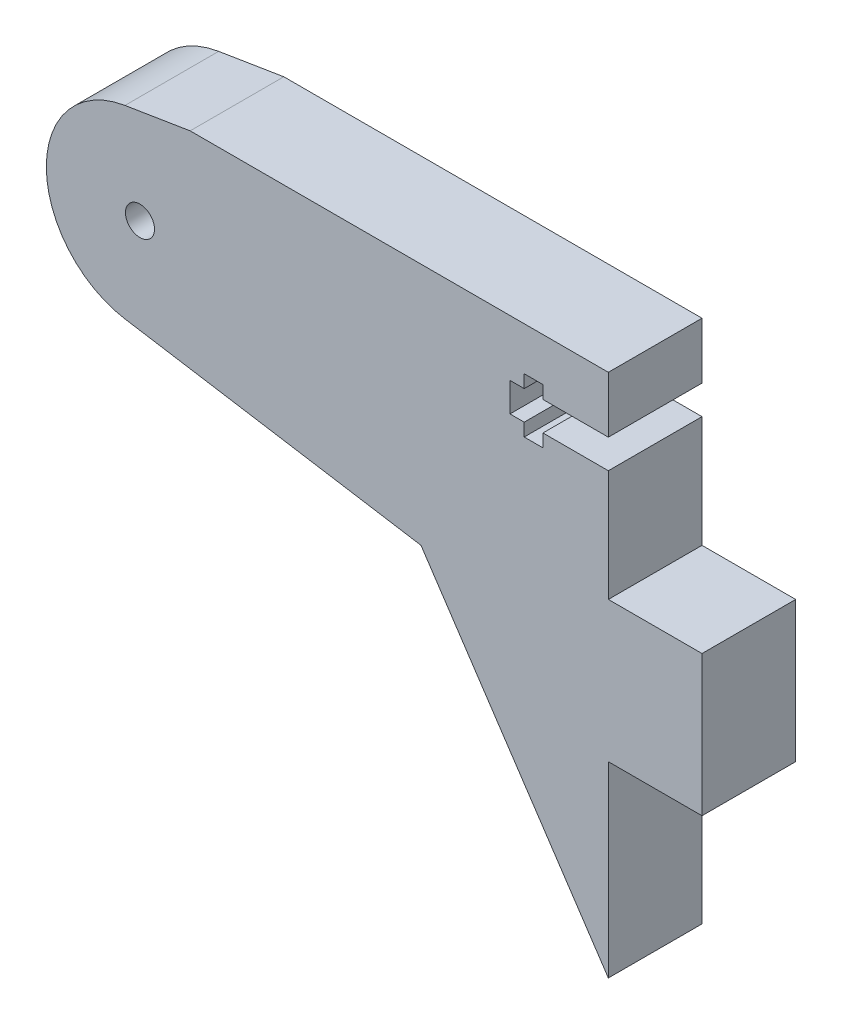
ISO-10303-21;
HEADER;
FILE_DESCRIPTION(('STEP AP214'),'2;1');
FILE_NAME('part.step','',(''),(''),'','','');
FILE_SCHEMA(('AUTOMOTIVE_DESIGN { 1 0 10303 214 1 1 1 1 }'));
ENDSEC;
DATA;
#1=APPLICATION_CONTEXT('core data for automotive mechanical design processes');
#2=APPLICATION_PROTOCOL_DEFINITION('international standard','automotive_design',2000,#1);
#3=PRODUCT_CONTEXT('',#1,'mechanical');
#4=PRODUCT('Part','Part','',(#3));
#5=PRODUCT_RELATED_PRODUCT_CATEGORY('part','',(#4));
#6=PRODUCT_DEFINITION_FORMATION('','',#4);
#7=PRODUCT_DEFINITION_CONTEXT('part definition',#1,'design');
#8=PRODUCT_DEFINITION('design','',#6,#7);
#9=PRODUCT_DEFINITION_SHAPE('','',#8);
#10=(LENGTH_UNIT() NAMED_UNIT(*) SI_UNIT(.MILLI.,.METRE.));
#11=(NAMED_UNIT(*) PLANE_ANGLE_UNIT() SI_UNIT($,.RADIAN.));
#12=(NAMED_UNIT(*) SI_UNIT($,.STERADIAN.) SOLID_ANGLE_UNIT());
#13=UNCERTAINTY_MEASURE_WITH_UNIT(LENGTH_MEASURE(1.E-05),#10,'distance_accuracy_value','');
#14=(GEOMETRIC_REPRESENTATION_CONTEXT(3) GLOBAL_UNCERTAINTY_ASSIGNED_CONTEXT((#13)) GLOBAL_UNIT_ASSIGNED_CONTEXT((#10,
#11,#12)) REPRESENTATION_CONTEXT('',''));
#15=CARTESIAN_POINT('',(0.,0.,0.));
#16=DIRECTION('',(0.,0.,1.));
#17=DIRECTION('',(1.,0.,0.));
#18=AXIS2_PLACEMENT_3D('',#15,#16,#17);
#19=CARTESIAN_POINT('',(-447.064585695293,-68.9557688613445,10.));
#20=DIRECTION('',(-1.,0.,0.));
#21=DIRECTION('',(0.,0.,1.));
#22=AXIS2_PLACEMENT_3D('',#19,#20,#21);
#23=PLANE('',#22);
#24=DIRECTION('',(0.,1.,0.));
#25=VECTOR('',#24,1.);
#26=CARTESIAN_POINT('',(-447.064585695293,-68.9557688613445,0.));
#27=LINE('',#26,#25);
#28=CARTESIAN_POINT('',(-447.064585695293,-78.9557688613445,0.));
#29=VERTEX_POINT('',#28);
#30=CARTESIAN_POINT('',(-447.064585695293,-72.9557688613445,0.));
#31=VERTEX_POINT('',#30);
#32=EDGE_CURVE('E196',#29,#31,#27,.T.);
#33=ORIENTED_EDGE('',*,*,#32,.T.);
#34=DIRECTION('',(0.,0.,-1.));
#35=VECTOR('',#34,1.);
#36=CARTESIAN_POINT('',(-447.064585695293,-72.9557688613445,10.));
#37=LINE('',#36,#35);
#38=CARTESIAN_POINT('',(-447.064585695293,-72.9557688613445,10.));
#39=VERTEX_POINT('',#38);
#40=EDGE_CURVE('E49',#39,#31,#37,.T.);
#41=ORIENTED_EDGE('',*,*,#40,.F.);
#42=DIRECTION('',(0.,1.,0.));
#43=VECTOR('',#42,1.);
#44=CARTESIAN_POINT('',(-447.064585695293,-68.9557688613445,10.));
#45=LINE('',#44,#43);
#46=CARTESIAN_POINT('',(-447.064585695293,-78.9557688613445,10.));
#47=VERTEX_POINT('',#46);
#48=EDGE_CURVE('E194',#47,#39,#45,.T.);
#49=ORIENTED_EDGE('',*,*,#48,.F.);
#50=DIRECTION('',(0.,0.,-1.));
#51=VECTOR('',#50,1.);
#52=CARTESIAN_POINT('',(-447.064585695293,-78.9557688613445,10.));
#53=LINE('',#52,#51);
#54=EDGE_CURVE('E330',#47,#29,#53,.T.);
#55=ORIENTED_EDGE('',*,*,#54,.T.);
#56=EDGE_LOOP('',(#33,#41,#49,#55));
#57=FACE_BOUND('',#56,.T.);
#58=ADVANCED_FACE('F34',(#57),#23,.F.);
#59=CARTESIAN_POINT('',(-467.064585695293,-68.9557688613445,10.));
#60=DIRECTION('',(0.160208282495524,-0.987083231657713,0.));
#61=DIRECTION('',(0.987083231657713,0.160208282495524,0.));
#62=AXIS2_PLACEMENT_3D('',#59,#60,#61);
#63=PLANE('',#62);
#64=DIRECTION('',(-0.987083231657713,-0.160208282495524,0.));
#65=VECTOR('',#64,1.);
#66=CARTESIAN_POINT('',(-467.064585695293,-68.9557688613445,10.));
#67=LINE('',#66,#65);
#68=CARTESIAN_POINT('',(-491.709584475186,-72.9557688613445,10.));
#69=VERTEX_POINT('',#68);
#70=CARTESIAN_POINT('',(-498.666668520249,-74.0849365447674,10.));
#71=VERTEX_POINT('',#70);
#72=EDGE_CURVE('E246',#69,#71,#67,.T.);
#73=ORIENTED_EDGE('',*,*,#72,.F.);
#74=DIRECTION('',(0.,0.,-1.));
#75=VECTOR('',#74,1.);
#76=CARTESIAN_POINT('',(-491.709584475186,-72.9557688613445,10.));
#77=LINE('',#76,#75);
#78=CARTESIAN_POINT('',(-491.709584475186,-72.9557688613445,0.));
#79=VERTEX_POINT('',#78);
#80=EDGE_CURVE('E184',#69,#79,#77,.T.);
#81=ORIENTED_EDGE('',*,*,#80,.T.);
#82=DIRECTION('',(-0.987083231657713,-0.160208282495524,0.));
#83=VECTOR('',#82,1.);
#84=CARTESIAN_POINT('',(-467.064585695293,-68.9557688613445,0.));
#85=LINE('',#84,#83);
#86=CARTESIAN_POINT('',(-498.666668520249,-74.0849365447674,0.));
#87=VERTEX_POINT('',#86);
#88=EDGE_CURVE('E243',#79,#87,#85,.T.);
#89=ORIENTED_EDGE('',*,*,#88,.T.);
#90=DIRECTION('',(0.,0.,-1.));
#91=VECTOR('',#90,1.);
#92=CARTESIAN_POINT('',(-498.666668520249,-74.0849365447674,10.));
#93=LINE('',#92,#91);
#94=EDGE_CURVE('E11',#71,#87,#93,.T.);
#95=ORIENTED_EDGE('',*,*,#94,.F.);
#96=EDGE_LOOP('',(#73,#81,#89,#95));
#97=FACE_BOUND('',#96,.T.);
#98=ADVANCED_FACE('F36',(#97),#63,.F.);
#99=CARTESIAN_POINT('',(-497.064585695293,-83.9557688613445,10.));
#100=DIRECTION('',(0.,0.,-1.));
#101=DIRECTION('',(-1.,0.,0.));
#102=AXIS2_PLACEMENT_3D('',#99,#100,#101);
#103=CYLINDRICAL_SURFACE('',#102,9.99999999999999);
#104=CARTESIAN_POINT('',(-497.064585695293,-83.9557688613445,0.));
#105=DIRECTION('',(0.,0.,1.));
#106=DIRECTION('',(1.,0.,0.));
#107=AXIS2_PLACEMENT_3D('',#104,#105,#106);
#108=CIRCLE('',#107,9.99999999999999);
#109=CARTESIAN_POINT('',(-498.666668520249,-93.8266011779216,0.));
#110=VERTEX_POINT('',#109);
#111=EDGE_CURVE('E261',#87,#110,#108,.T.);
#112=ORIENTED_EDGE('',*,*,#111,.T.);
#113=DIRECTION('',(0.,0.,-1.));
#114=VECTOR('',#113,1.);
#115=CARTESIAN_POINT('',(-498.666668520249,-93.8266011779216,10.));
#116=LINE('',#115,#114);
#117=CARTESIAN_POINT('',(-498.666668520249,-93.8266011779216,10.));
#118=VERTEX_POINT('',#117);
#119=EDGE_CURVE('E42',#118,#110,#116,.T.);
#120=ORIENTED_EDGE('',*,*,#119,.F.);
#121=CARTESIAN_POINT('',(-497.064585695293,-83.9557688613445,10.));
#122=DIRECTION('',(0.,0.,1.));
#123=DIRECTION('',(1.,0.,0.));
#124=AXIS2_PLACEMENT_3D('',#121,#122,#123);
#125=CIRCLE('',#124,9.99999999999999);
#126=EDGE_CURVE('E248',#71,#118,#125,.T.);
#127=ORIENTED_EDGE('',*,*,#126,.F.);
#128=ORIENTED_EDGE('',*,*,#94,.T.);
#129=EDGE_LOOP('',(#112,#120,#127,#128));
#130=FACE_BOUND('',#129,.T.);
#131=ADVANCED_FACE('F294',(#130),#103,.T.);
#132=CARTESIAN_POINT('',(-467.064585695293,-98.9557688613445,10.));
#133=DIRECTION('',(0.160208282495523,0.987083231657713,0.));
#134=DIRECTION('',(-0.987083231657713,0.160208282495523,0.));
#135=AXIS2_PLACEMENT_3D('',#132,#133,#134);
#136=PLANE('',#135);
#137=DIRECTION('',(0.987083231657713,-0.160208282495523,0.));
#138=VECTOR('',#137,1.);
#139=CARTESIAN_POINT('',(-467.064585695293,-98.9557688613445,0.));
#140=LINE('',#139,#138);
#141=CARTESIAN_POINT('',(-467.064585695293,-98.9557688613445,0.));
#142=VERTEX_POINT('',#141);
#143=EDGE_CURVE('E263',#110,#142,#140,.T.);
#144=ORIENTED_EDGE('',*,*,#143,.T.);
#145=DIRECTION('',(0.,0.,-1.));
#146=VECTOR('',#145,1.);
#147=CARTESIAN_POINT('',(-467.064585695293,-98.9557688613445,10.));
#148=LINE('',#147,#146);
#149=CARTESIAN_POINT('',(-467.064585695293,-98.9557688613445,10.));
#150=VERTEX_POINT('',#149);
#151=EDGE_CURVE('E271',#150,#142,#148,.T.);
#152=ORIENTED_EDGE('',*,*,#151,.F.);
#153=DIRECTION('',(0.987083231657713,-0.160208282495523,0.));
#154=VECTOR('',#153,1.);
#155=CARTESIAN_POINT('',(-467.064585695293,-98.9557688613445,10.));
#156=LINE('',#155,#154);
#157=EDGE_CURVE('E251',#118,#150,#156,.T.);
#158=ORIENTED_EDGE('',*,*,#157,.F.);
#159=ORIENTED_EDGE('',*,*,#119,.T.);
#160=EDGE_LOOP('',(#144,#152,#158,#159));
#161=FACE_BOUND('',#160,.T.);
#162=ADVANCED_FACE('F278',(#161),#136,.F.);
#163=CARTESIAN_POINT('',(-447.064585695293,-128.955768861344,10.));
#164=DIRECTION('',(0.832050294337844,0.554700196225228,0.));
#165=DIRECTION('',(-0.554700196225228,0.832050294337844,0.));
#166=AXIS2_PLACEMENT_3D('',#163,#164,#165);
#167=PLANE('',#166);
#168=DIRECTION('',(0.554700196225228,-0.832050294337844,0.));
#169=VECTOR('',#168,1.);
#170=CARTESIAN_POINT('',(-447.064585695293,-128.955768861344,0.));
#171=LINE('',#170,#169);
#172=CARTESIAN_POINT('',(-447.064585695293,-128.955768861344,0.));
#173=VERTEX_POINT('',#172);
#174=EDGE_CURVE('E265',#142,#173,#171,.T.);
#175=ORIENTED_EDGE('',*,*,#174,.T.);
#176=DIRECTION('',(0.,0.,-1.));
#177=VECTOR('',#176,1.);
#178=CARTESIAN_POINT('',(-447.064585695293,-128.955768861344,10.));
#179=LINE('',#178,#177);
#180=CARTESIAN_POINT('',(-447.064585695293,-128.955768861344,10.));
#181=VERTEX_POINT('',#180);
#182=EDGE_CURVE('E259',#181,#173,#179,.T.);
#183=ORIENTED_EDGE('',*,*,#182,.F.);
#184=DIRECTION('',(0.554700196225228,-0.832050294337844,0.));
#185=VECTOR('',#184,1.);
#186=CARTESIAN_POINT('',(-447.064585695293,-128.955768861344,10.));
#187=LINE('',#186,#185);
#188=EDGE_CURVE('E253',#150,#181,#187,.T.);
#189=ORIENTED_EDGE('',*,*,#188,.F.);
#190=ORIENTED_EDGE('',*,*,#151,.T.);
#191=EDGE_LOOP('',(#175,#183,#189,#190));
#192=FACE_BOUND('',#191,.T.);
#193=ADVANCED_FACE('F291',(#192),#167,.F.);
#194=CARTESIAN_POINT('',(-437.064585695293,-68.9557688613445,10.));
#195=DIRECTION('',(-1.,0.,0.));
#196=DIRECTION('',(0.,0.,1.));
#197=AXIS2_PLACEMENT_3D('',#194,#195,#196);
#198=PLANE('',#197);
#199=DIRECTION('',(0.,1.,0.));
#200=VECTOR('',#199,1.);
#201=CARTESIAN_POINT('',(-437.064585695293,-68.9557688613445,0.));
#202=LINE('',#201,#200);
#203=CARTESIAN_POINT('',(-437.064585695293,-108.955768861344,0.));
#204=VERTEX_POINT('',#203);
#205=CARTESIAN_POINT('',(-437.064585695293,-93.9557688613445,0.));
#206=VERTEX_POINT('',#205);
#207=EDGE_CURVE('E249',#204,#206,#202,.T.);
#208=ORIENTED_EDGE('',*,*,#207,.T.);
#209=DIRECTION('',(0.,0.,-1.));
#210=VECTOR('',#209,1.);
#211=CARTESIAN_POINT('',(-437.064585695293,-93.9557688613445,10.));
#212=LINE('',#211,#210);
#213=CARTESIAN_POINT('',(-437.064585695293,-93.9557688613445,10.));
#214=VERTEX_POINT('',#213);
#215=EDGE_CURVE('E208',#214,#206,#212,.T.);
#216=ORIENTED_EDGE('',*,*,#215,.F.);
#217=DIRECTION('',(0.,1.,0.));
#218=VECTOR('',#217,1.);
#219=CARTESIAN_POINT('',(-437.064585695293,-128.955768861344,10.));
#220=LINE('',#219,#218);
#221=CARTESIAN_POINT('',(-437.064585695293,-108.955768861344,10.));
#222=VERTEX_POINT('',#221);
#223=EDGE_CURVE('E256',#222,#214,#220,.T.);
#224=ORIENTED_EDGE('',*,*,#223,.F.);
#225=DIRECTION('',(0.,0.,-1.));
#226=VECTOR('',#225,1.);
#227=CARTESIAN_POINT('',(-437.064585695293,-108.955768861344,10.));
#228=LINE('',#227,#226);
#229=EDGE_CURVE('E231',#222,#204,#228,.T.);
#230=ORIENTED_EDGE('',*,*,#229,.T.);
#231=EDGE_LOOP('',(#208,#216,#224,#230));
#232=FACE_BOUND('',#231,.T.);
#233=ADVANCED_FACE('F430',(#232),#198,.F.);
#234=CARTESIAN_POINT('',(-497.064585695293,-83.9557688613445,10.));
#235=DIRECTION('',(0.,0.,1.));
#236=DIRECTION('',(1.,0.,0.));
#237=AXIS2_PLACEMENT_3D('',#234,#235,#236);
#238=PLANE('',#237);
#239=DIRECTION('',(-1.,0.,0.));
#240=VECTOR('',#239,1.);
#241=CARTESIAN_POINT('',(-447.064585695293,-72.9557688613445,10.));
#242=LINE('',#241,#240);
#243=EDGE_CURVE('E181',#39,#69,#242,.T.);
#244=ORIENTED_EDGE('',*,*,#243,.T.);
#245=ORIENTED_EDGE('',*,*,#72,.T.);
#246=ORIENTED_EDGE('',*,*,#126,.T.);
#247=ORIENTED_EDGE('',*,*,#157,.T.);
#248=ORIENTED_EDGE('',*,*,#188,.T.);
#249=DIRECTION('',(0.,1.,0.));
#250=VECTOR('',#249,1.);
#251=CARTESIAN_POINT('',(-447.064585695293,-108.955768861344,10.));
#252=LINE('',#251,#250);
#253=CARTESIAN_POINT('',(-447.064585695293,-108.955768861344,10.));
#254=VERTEX_POINT('',#253);
#255=EDGE_CURVE('E227',#181,#254,#252,.T.);
#256=ORIENTED_EDGE('',*,*,#255,.T.);
#257=DIRECTION('',(1.,0.,0.));
#258=VECTOR('',#257,1.);
#259=CARTESIAN_POINT('',(-437.064585695293,-108.955768861344,10.));
#260=LINE('',#259,#258);
#261=EDGE_CURVE('E224',#254,#222,#260,.T.);
#262=ORIENTED_EDGE('',*,*,#261,.T.);
#263=ORIENTED_EDGE('',*,*,#223,.T.);
#264=DIRECTION('',(-1.,0.,0.));
#265=VECTOR('',#264,1.);
#266=CARTESIAN_POINT('',(-437.064585695293,-93.9557688613445,10.));
#267=LINE('',#266,#265);
#268=CARTESIAN_POINT('',(-447.064585695293,-93.9557688613445,10.));
#269=VERTEX_POINT('',#268);
#270=EDGE_CURVE('E205',#214,#269,#267,.T.);
#271=ORIENTED_EDGE('',*,*,#270,.T.);
#272=CARTESIAN_POINT('',(-447.064585695293,-82.0557688613445,10.));
#273=VERTEX_POINT('',#272);
#274=EDGE_CURVE('E204',#269,#273,#45,.T.);
#275=ORIENTED_EDGE('',*,*,#274,.T.);
#276=DIRECTION('',(-1.,0.,0.));
#277=VECTOR('',#276,1.);
#278=CARTESIAN_POINT('',(-447.064585695293,-82.0557688613445,10.));
#279=LINE('',#278,#277);
#280=CARTESIAN_POINT('',(-454.046285695293,-82.0557688613445,10.));
#281=VERTEX_POINT('',#280);
#282=EDGE_CURVE('E57',#273,#281,#279,.T.);
#283=ORIENTED_EDGE('',*,*,#282,.T.);
#284=DIRECTION('',(0.,-1.,0.));
#285=VECTOR('',#284,1.);
#286=CARTESIAN_POINT('',(-454.046285695293,-82.0557688613445,10.));
#287=LINE('',#286,#285);
#288=CARTESIAN_POINT('',(-454.046285695293,-83.4307688613445,10.));
#289=VERTEX_POINT('',#288);
#290=EDGE_CURVE('E304',#281,#289,#287,.T.);
#291=ORIENTED_EDGE('',*,*,#290,.T.);
#292=DIRECTION('',(-1.,0.,0.));
#293=VECTOR('',#292,1.);
#294=CARTESIAN_POINT('',(-454.046285695293,-83.4307688613445,10.));
#295=LINE('',#294,#293);
#296=CARTESIAN_POINT('',(-456.046285695293,-83.4307688613445,10.));
#297=VERTEX_POINT('',#296);
#298=EDGE_CURVE('E307',#289,#297,#295,.T.);
#299=ORIENTED_EDGE('',*,*,#298,.T.);
#300=DIRECTION('',(0.,1.,0.));
#301=VECTOR('',#300,1.);
#302=CARTESIAN_POINT('',(-456.046285695293,-82.0557688613445,10.));
#303=LINE('',#302,#301);
#304=CARTESIAN_POINT('',(-456.046285695293,-82.0557688613445,10.));
#305=VERTEX_POINT('',#304);
#306=EDGE_CURVE('E310',#297,#305,#303,.T.);
#307=ORIENTED_EDGE('',*,*,#306,.T.);
#308=DIRECTION('',(-1.,0.,0.));
#309=VECTOR('',#308,1.);
#310=CARTESIAN_POINT('',(-456.046285695293,-82.0557688613445,10.));
#311=LINE('',#310,#309);
#312=CARTESIAN_POINT('',(-457.564585695293,-82.0557688613445,10.));
#313=VERTEX_POINT('',#312);
#314=EDGE_CURVE('E313',#305,#313,#311,.T.);
#315=ORIENTED_EDGE('',*,*,#314,.T.);
#316=DIRECTION('',(0.,1.,0.));
#317=VECTOR('',#316,1.);
#318=CARTESIAN_POINT('',(-457.564585695293,-78.9557688613445,10.));
#319=LINE('',#318,#317);
#320=CARTESIAN_POINT('',(-457.564585695293,-78.9557688613445,10.));
#321=VERTEX_POINT('',#320);
#322=EDGE_CURVE('E316',#313,#321,#319,.T.);
#323=ORIENTED_EDGE('',*,*,#322,.T.);
#324=DIRECTION('',(1.,0.,0.));
#325=VECTOR('',#324,1.);
#326=CARTESIAN_POINT('',(-456.046285695293,-78.9557688613445,10.));
#327=LINE('',#326,#325);
#328=CARTESIAN_POINT('',(-456.046285695293,-78.9557688613445,10.));
#329=VERTEX_POINT('',#328);
#330=EDGE_CURVE('E319',#321,#329,#327,.T.);
#331=ORIENTED_EDGE('',*,*,#330,.T.);
#332=DIRECTION('',(0.,1.,0.));
#333=VECTOR('',#332,1.);
#334=CARTESIAN_POINT('',(-456.046285695293,-77.5807688613445,10.));
#335=LINE('',#334,#333);
#336=CARTESIAN_POINT('',(-456.046285695293,-77.5807688613445,10.));
#337=VERTEX_POINT('',#336);
#338=EDGE_CURVE('E322',#329,#337,#335,.T.);
#339=ORIENTED_EDGE('',*,*,#338,.T.);
#340=DIRECTION('',(1.,0.,0.));
#341=VECTOR('',#340,1.);
#342=CARTESIAN_POINT('',(-454.046285695293,-77.5807688613445,10.));
#343=LINE('',#342,#341);
#344=CARTESIAN_POINT('',(-454.046285695293,-77.5807688613445,10.));
#345=VERTEX_POINT('',#344);
#346=EDGE_CURVE('E325',#337,#345,#343,.T.);
#347=ORIENTED_EDGE('',*,*,#346,.T.);
#348=DIRECTION('',(0.,-1.,0.));
#349=VECTOR('',#348,1.);
#350=CARTESIAN_POINT('',(-454.046285695293,-77.5807688613445,10.));
#351=LINE('',#350,#349);
#352=CARTESIAN_POINT('',(-454.046285695293,-78.9557688613445,10.));
#353=VERTEX_POINT('',#352);
#354=EDGE_CURVE('E328',#345,#353,#351,.T.);
#355=ORIENTED_EDGE('',*,*,#354,.T.);
#356=DIRECTION('',(1.,0.,0.));
#357=VECTOR('',#356,1.);
#358=CARTESIAN_POINT('',(-447.064585695293,-78.9557688613445,10.));
#359=LINE('',#358,#357);
#360=EDGE_CURVE('E203',#353,#47,#359,.T.);
#361=ORIENTED_EDGE('',*,*,#360,.T.);
#362=ORIENTED_EDGE('',*,*,#48,.T.);
#363=EDGE_LOOP('',(#244,#245,#246,#247,#248,#256,#262,#263,#271,#275,#283,#291,#299,#307,#315,
#323,#331,#339,#347,#355,#361,#362));
#364=FACE_BOUND('',#363,.T.);
#365=CARTESIAN_POINT('',(-497.064585695293,-83.9557688613445,10.));
#366=DIRECTION('',(0.,0.,1.));
#367=DIRECTION('',(1.,0.,0.));
#368=AXIS2_PLACEMENT_3D('',#365,#366,#367);
#369=CIRCLE('',#368,1.54999999999999);
#370=CARTESIAN_POINT('',(-495.514585695293,-83.9557688613445,10.));
#371=VERTEX_POINT('',#370);
#372=EDGE_CURVE('E237',#371,#371,#369,.T.);
#373=ORIENTED_EDGE('',*,*,#372,.F.);
#374=EDGE_LOOP('',(#373));
#375=FACE_BOUND('',#374,.T.);
#376=ADVANCED_FACE('F199',(#364,#375),#238,.T.);
#377=CARTESIAN_POINT('',(-497.064585695293,-83.9557688613445,0.));
#378=DIRECTION('',(0.,0.,1.));
#379=DIRECTION('',(1.,0.,0.));
#380=AXIS2_PLACEMENT_3D('',#377,#378,#379);
#381=PLANE('',#380);
#382=CARTESIAN_POINT('',(-497.064585695293,-83.9557688613445,0.));
#383=DIRECTION('',(0.,0.,1.));
#384=DIRECTION('',(1.,0.,0.));
#385=AXIS2_PLACEMENT_3D('',#382,#383,#384);
#386=CIRCLE('',#385,1.54999999999999);
#387=CARTESIAN_POINT('',(-495.514585695293,-83.9557688613445,0.));
#388=VERTEX_POINT('',#387);
#389=EDGE_CURVE('E240',#388,#388,#386,.T.);
#390=ORIENTED_EDGE('',*,*,#389,.T.);
#391=EDGE_LOOP('',(#390));
#392=FACE_BOUND('',#391,.T.);
#393=ORIENTED_EDGE('',*,*,#88,.F.);
#394=DIRECTION('',(-1.,0.,0.));
#395=VECTOR('',#394,1.);
#396=CARTESIAN_POINT('',(-447.064585695293,-72.9557688613445,0.));
#397=LINE('',#396,#395);
#398=EDGE_CURVE('E188',#31,#79,#397,.T.);
#399=ORIENTED_EDGE('',*,*,#398,.F.);
#400=ORIENTED_EDGE('',*,*,#32,.F.);
#401=DIRECTION('',(1.,0.,0.));
#402=VECTOR('',#401,1.);
#403=CARTESIAN_POINT('',(-447.064585695293,-78.9557688613445,0.));
#404=LINE('',#403,#402);
#405=CARTESIAN_POINT('',(-454.046285695293,-78.9557688613445,0.));
#406=VERTEX_POINT('',#405);
#407=EDGE_CURVE('E299',#406,#29,#404,.T.);
#408=ORIENTED_EDGE('',*,*,#407,.F.);
#409=DIRECTION('',(0.,-1.,0.));
#410=VECTOR('',#409,1.);
#411=CARTESIAN_POINT('',(-454.046285695293,-77.5807688613445,0.));
#412=LINE('',#411,#410);
#413=CARTESIAN_POINT('',(-454.046285695293,-77.5807688613445,0.));
#414=VERTEX_POINT('',#413);
#415=EDGE_CURVE('E302',#414,#406,#412,.T.);
#416=ORIENTED_EDGE('',*,*,#415,.F.);
#417=DIRECTION('',(1.,0.,0.));
#418=VECTOR('',#417,1.);
#419=CARTESIAN_POINT('',(-454.046285695293,-77.5807688613445,0.));
#420=LINE('',#419,#418);
#421=CARTESIAN_POINT('',(-456.046285695293,-77.5807688613445,0.));
#422=VERTEX_POINT('',#421);
#423=EDGE_CURVE('E356',#422,#414,#420,.T.);
#424=ORIENTED_EDGE('',*,*,#423,.F.);
#425=DIRECTION('',(0.,1.,0.));
#426=VECTOR('',#425,1.);
#427=CARTESIAN_POINT('',(-456.046285695293,-77.5807688613445,0.));
#428=LINE('',#427,#426);
#429=CARTESIAN_POINT('',(-456.046285695293,-78.9557688613445,0.));
#430=VERTEX_POINT('',#429);
#431=EDGE_CURVE('E353',#430,#422,#428,.T.);
#432=ORIENTED_EDGE('',*,*,#431,.F.);
#433=DIRECTION('',(1.,0.,0.));
#434=VECTOR('',#433,1.);
#435=CARTESIAN_POINT('',(-456.046285695293,-78.9557688613445,0.));
#436=LINE('',#435,#434);
#437=CARTESIAN_POINT('',(-457.564585695293,-78.9557688613445,0.));
#438=VERTEX_POINT('',#437);
#439=EDGE_CURVE('E350',#438,#430,#436,.T.);
#440=ORIENTED_EDGE('',*,*,#439,.F.);
#441=DIRECTION('',(0.,1.,0.));
#442=VECTOR('',#441,1.);
#443=CARTESIAN_POINT('',(-457.564585695293,-78.9557688613445,0.));
#444=LINE('',#443,#442);
#445=CARTESIAN_POINT('',(-457.564585695293,-82.0557688613445,0.));
#446=VERTEX_POINT('',#445);
#447=EDGE_CURVE('E347',#446,#438,#444,.T.);
#448=ORIENTED_EDGE('',*,*,#447,.F.);
#449=DIRECTION('',(-1.,0.,0.));
#450=VECTOR('',#449,1.);
#451=CARTESIAN_POINT('',(-456.046285695293,-82.0557688613445,0.));
#452=LINE('',#451,#450);
#453=CARTESIAN_POINT('',(-456.046285695293,-82.0557688613445,0.));
#454=VERTEX_POINT('',#453);
#455=EDGE_CURVE('E344',#454,#446,#452,.T.);
#456=ORIENTED_EDGE('',*,*,#455,.F.);
#457=DIRECTION('',(0.,1.,0.));
#458=VECTOR('',#457,1.);
#459=CARTESIAN_POINT('',(-456.046285695293,-82.0557688613445,0.));
#460=LINE('',#459,#458);
#461=CARTESIAN_POINT('',(-456.046285695293,-83.4307688613445,0.));
#462=VERTEX_POINT('',#461);
#463=EDGE_CURVE('E341',#462,#454,#460,.T.);
#464=ORIENTED_EDGE('',*,*,#463,.F.);
#465=DIRECTION('',(-1.,0.,0.));
#466=VECTOR('',#465,1.);
#467=CARTESIAN_POINT('',(-454.046285695293,-83.4307688613445,0.));
#468=LINE('',#467,#466);
#469=CARTESIAN_POINT('',(-454.046285695293,-83.4307688613445,0.));
#470=VERTEX_POINT('',#469);
#471=EDGE_CURVE('E338',#470,#462,#468,.T.);
#472=ORIENTED_EDGE('',*,*,#471,.F.);
#473=DIRECTION('',(0.,-1.,0.));
#474=VECTOR('',#473,1.);
#475=CARTESIAN_POINT('',(-454.046285695293,-82.0557688613445,0.));
#476=LINE('',#475,#474);
#477=CARTESIAN_POINT('',(-454.046285695293,-82.0557688613445,0.));
#478=VERTEX_POINT('',#477);
#479=EDGE_CURVE('E335',#478,#470,#476,.T.);
#480=ORIENTED_EDGE('',*,*,#479,.F.);
#481=DIRECTION('',(-1.,0.,0.));
#482=VECTOR('',#481,1.);
#483=CARTESIAN_POINT('',(-447.064585695293,-82.0557688613445,0.));
#484=LINE('',#483,#482);
#485=CARTESIAN_POINT('',(-447.064585695293,-82.0557688613445,0.));
#486=VERTEX_POINT('',#485);
#487=EDGE_CURVE('E332',#486,#478,#484,.T.);
#488=ORIENTED_EDGE('',*,*,#487,.F.);
#489=CARTESIAN_POINT('',(-447.064585695293,-93.9557688613445,0.));
#490=VERTEX_POINT('',#489);
#491=EDGE_CURVE('E210',#490,#486,#27,.T.);
#492=ORIENTED_EDGE('',*,*,#491,.F.);
#493=DIRECTION('',(-1.,0.,0.));
#494=VECTOR('',#493,1.);
#495=CARTESIAN_POINT('',(-437.064585695293,-93.9557688613445,0.));
#496=LINE('',#495,#494);
#497=EDGE_CURVE('E214',#206,#490,#496,.T.);
#498=ORIENTED_EDGE('',*,*,#497,.F.);
#499=ORIENTED_EDGE('',*,*,#207,.F.);
#500=DIRECTION('',(1.,0.,0.));
#501=VECTOR('',#500,1.);
#502=CARTESIAN_POINT('',(-437.064585695293,-108.955768861344,0.));
#503=LINE('',#502,#501);
#504=CARTESIAN_POINT('',(-447.064585695293,-108.955768861344,0.));
#505=VERTEX_POINT('',#504);
#506=EDGE_CURVE('E222',#505,#204,#503,.T.);
#507=ORIENTED_EDGE('',*,*,#506,.F.);
#508=DIRECTION('',(0.,1.,0.));
#509=VECTOR('',#508,1.);
#510=CARTESIAN_POINT('',(-447.064585695293,-108.955768861344,0.));
#511=LINE('',#510,#509);
#512=EDGE_CURVE('E228',#173,#505,#511,.T.);
#513=ORIENTED_EDGE('',*,*,#512,.F.);
#514=ORIENTED_EDGE('',*,*,#174,.F.);
#515=ORIENTED_EDGE('',*,*,#143,.F.);
#516=ORIENTED_EDGE('',*,*,#111,.F.);
#517=EDGE_LOOP('',(#393,#399,#400,#408,#416,#424,#432,#440,#448,#456,#464,#472,#480,#488,#492,
#498,#499,#507,#513,#514,#515,#516));
#518=FACE_BOUND('',#517,.T.);
#519=ADVANCED_FACE('F286',(#392,#518),#381,.F.);
#520=CARTESIAN_POINT('',(-497.064585695293,-83.9557688613445,0.));
#521=DIRECTION('',(0.,0.,1.));
#522=DIRECTION('',(1.,0.,0.));
#523=AXIS2_PLACEMENT_3D('',#520,#521,#522);
#524=CYLINDRICAL_SURFACE('',#523,1.54999999999999);
#525=ORIENTED_EDGE('',*,*,#389,.F.);
#526=EDGE_LOOP('',(#525));
#527=FACE_BOUND('',#526,.T.);
#528=ORIENTED_EDGE('',*,*,#372,.T.);
#529=EDGE_LOOP('',(#528));
#530=FACE_BOUND('',#529,.T.);
#531=ADVANCED_FACE('F444',(#527,#530),#524,.F.);
#532=CARTESIAN_POINT('',(-437.064585695293,-108.955768861344,10.));
#533=DIRECTION('',(0.,1.,0.));
#534=DIRECTION('',(0.,0.,1.));
#535=AXIS2_PLACEMENT_3D('',#532,#533,#534);
#536=PLANE('',#535);
#537=ORIENTED_EDGE('',*,*,#506,.T.);
#538=ORIENTED_EDGE('',*,*,#229,.F.);
#539=ORIENTED_EDGE('',*,*,#261,.F.);
#540=DIRECTION('',(0.,0.,-1.));
#541=VECTOR('',#540,1.);
#542=CARTESIAN_POINT('',(-447.064585695293,-108.955768861344,10.));
#543=LINE('',#542,#541);
#544=EDGE_CURVE('E235',#254,#505,#543,.T.);
#545=ORIENTED_EDGE('',*,*,#544,.T.);
#546=EDGE_LOOP('',(#537,#538,#539,#545));
#547=FACE_BOUND('',#546,.T.);
#548=ADVANCED_FACE('F434',(#547),#536,.F.);
#549=CARTESIAN_POINT('',(-447.064585695293,-108.955768861344,10.));
#550=DIRECTION('',(-1.,0.,0.));
#551=DIRECTION('',(0.,0.,1.));
#552=AXIS2_PLACEMENT_3D('',#549,#550,#551);
#553=PLANE('',#552);
#554=ORIENTED_EDGE('',*,*,#512,.T.);
#555=ORIENTED_EDGE('',*,*,#544,.F.);
#556=ORIENTED_EDGE('',*,*,#255,.F.);
#557=ORIENTED_EDGE('',*,*,#182,.T.);
#558=EDGE_LOOP('',(#554,#555,#556,#557));
#559=FACE_BOUND('',#558,.T.);
#560=ADVANCED_FACE('F436',(#559),#553,.F.);
#561=ORIENTED_EDGE('',*,*,#491,.T.);
#562=DIRECTION('',(0.,0.,-1.));
#563=VECTOR('',#562,1.);
#564=CARTESIAN_POINT('',(-447.064585695293,-82.0557688613445,10.));
#565=LINE('',#564,#563);
#566=EDGE_CURVE('E380',#273,#486,#565,.T.);
#567=ORIENTED_EDGE('',*,*,#566,.F.);
#568=ORIENTED_EDGE('',*,*,#274,.F.);
#569=DIRECTION('',(0.,0.,-1.));
#570=VECTOR('',#569,1.);
#571=CARTESIAN_POINT('',(-447.064585695293,-93.9557688613445,10.));
#572=LINE('',#571,#570);
#573=EDGE_CURVE('E220',#269,#490,#572,.T.);
#574=ORIENTED_EDGE('',*,*,#573,.T.);
#575=EDGE_LOOP('',(#561,#567,#568,#574));
#576=FACE_BOUND('',#575,.T.);
#577=ADVANCED_FACE('F423',(#576),#23,.F.);
#578=CARTESIAN_POINT('',(-437.064585695293,-93.9557688613445,10.));
#579=DIRECTION('',(0.,-1.,0.));
#580=DIRECTION('',(0.,0.,-1.));
#581=AXIS2_PLACEMENT_3D('',#578,#579,#580);
#582=PLANE('',#581);
#583=ORIENTED_EDGE('',*,*,#497,.T.);
#584=ORIENTED_EDGE('',*,*,#573,.F.);
#585=ORIENTED_EDGE('',*,*,#270,.F.);
#586=ORIENTED_EDGE('',*,*,#215,.T.);
#587=EDGE_LOOP('',(#583,#584,#585,#586));
#588=FACE_BOUND('',#587,.T.);
#589=ADVANCED_FACE('F426',(#588),#582,.F.);
#590=CARTESIAN_POINT('',(-447.064585695293,-78.9557688613445,10.));
#591=DIRECTION('',(0.,1.,0.));
#592=DIRECTION('',(0.,0.,1.));
#593=AXIS2_PLACEMENT_3D('',#590,#591,#592);
#594=PLANE('',#593);
#595=ORIENTED_EDGE('',*,*,#407,.T.);
#596=ORIENTED_EDGE('',*,*,#54,.F.);
#597=ORIENTED_EDGE('',*,*,#360,.F.);
#598=DIRECTION('',(0.,0.,-1.));
#599=VECTOR('',#598,1.);
#600=CARTESIAN_POINT('',(-454.046285695293,-78.9557688613445,10.));
#601=LINE('',#600,#599);
#602=EDGE_CURVE('E217',#353,#406,#601,.T.);
#603=ORIENTED_EDGE('',*,*,#602,.T.);
#604=EDGE_LOOP('',(#595,#596,#597,#603));
#605=FACE_BOUND('',#604,.T.);
#606=ADVANCED_FACE('F382',(#605),#594,.F.);
#607=CARTESIAN_POINT('',(-454.046285695293,-77.5807688613445,10.));
#608=DIRECTION('',(1.,0.,0.));
#609=DIRECTION('',(0.,0.,-1.));
#610=AXIS2_PLACEMENT_3D('',#607,#608,#609);
#611=PLANE('',#610);
#612=ORIENTED_EDGE('',*,*,#415,.T.);
#613=ORIENTED_EDGE('',*,*,#602,.F.);
#614=ORIENTED_EDGE('',*,*,#354,.F.);
#615=DIRECTION('',(0.,0.,-1.));
#616=VECTOR('',#615,1.);
#617=CARTESIAN_POINT('',(-454.046285695293,-77.5807688613445,10.));
#618=LINE('',#617,#616);
#619=EDGE_CURVE('E362',#345,#414,#618,.T.);
#620=ORIENTED_EDGE('',*,*,#619,.T.);
#621=EDGE_LOOP('',(#612,#613,#614,#620));
#622=FACE_BOUND('',#621,.T.);
#623=ADVANCED_FACE('F387',(#622),#611,.F.);
#624=CARTESIAN_POINT('',(-454.046285695293,-77.5807688613445,10.));
#625=DIRECTION('',(0.,1.,0.));
#626=DIRECTION('',(0.,0.,1.));
#627=AXIS2_PLACEMENT_3D('',#624,#625,#626);
#628=PLANE('',#627);
#629=ORIENTED_EDGE('',*,*,#423,.T.);
#630=ORIENTED_EDGE('',*,*,#619,.F.);
#631=ORIENTED_EDGE('',*,*,#346,.F.);
#632=DIRECTION('',(0.,0.,-1.));
#633=VECTOR('',#632,1.);
#634=CARTESIAN_POINT('',(-456.046285695293,-77.5807688613445,10.));
#635=LINE('',#634,#633);
#636=EDGE_CURVE('E364',#337,#422,#635,.T.);
#637=ORIENTED_EDGE('',*,*,#636,.T.);
#638=EDGE_LOOP('',(#629,#630,#631,#637));
#639=FACE_BOUND('',#638,.T.);
#640=ADVANCED_FACE('F391',(#639),#628,.F.);
#641=CARTESIAN_POINT('',(-456.046285695293,-77.5807688613445,10.));
#642=DIRECTION('',(-1.,0.,0.));
#643=DIRECTION('',(0.,0.,1.));
#644=AXIS2_PLACEMENT_3D('',#641,#642,#643);
#645=PLANE('',#644);
#646=ORIENTED_EDGE('',*,*,#431,.T.);
#647=ORIENTED_EDGE('',*,*,#636,.F.);
#648=ORIENTED_EDGE('',*,*,#338,.F.);
#649=DIRECTION('',(0.,0.,-1.));
#650=VECTOR('',#649,1.);
#651=CARTESIAN_POINT('',(-456.046285695293,-78.9557688613445,10.));
#652=LINE('',#651,#650);
#653=EDGE_CURVE('E366',#329,#430,#652,.T.);
#654=ORIENTED_EDGE('',*,*,#653,.T.);
#655=EDGE_LOOP('',(#646,#647,#648,#654));
#656=FACE_BOUND('',#655,.T.);
#657=ADVANCED_FACE('F394',(#656),#645,.F.);
#658=CARTESIAN_POINT('',(-456.046285695293,-78.9557688613445,10.));
#659=DIRECTION('',(0.,1.,0.));
#660=DIRECTION('',(0.,0.,1.));
#661=AXIS2_PLACEMENT_3D('',#658,#659,#660);
#662=PLANE('',#661);
#663=ORIENTED_EDGE('',*,*,#439,.T.);
#664=ORIENTED_EDGE('',*,*,#653,.F.);
#665=ORIENTED_EDGE('',*,*,#330,.F.);
#666=DIRECTION('',(0.,0.,-1.));
#667=VECTOR('',#666,1.);
#668=CARTESIAN_POINT('',(-457.564585695293,-78.9557688613445,10.));
#669=LINE('',#668,#667);
#670=EDGE_CURVE('E368',#321,#438,#669,.T.);
#671=ORIENTED_EDGE('',*,*,#670,.T.);
#672=EDGE_LOOP('',(#663,#664,#665,#671));
#673=FACE_BOUND('',#672,.T.);
#674=ADVANCED_FACE('F399',(#673),#662,.F.);
#675=CARTESIAN_POINT('',(-457.564585695293,-78.9557688613445,10.));
#676=DIRECTION('',(-1.,0.,0.));
#677=DIRECTION('',(0.,0.,1.));
#678=AXIS2_PLACEMENT_3D('',#675,#676,#677);
#679=PLANE('',#678);
#680=ORIENTED_EDGE('',*,*,#447,.T.);
#681=ORIENTED_EDGE('',*,*,#670,.F.);
#682=ORIENTED_EDGE('',*,*,#322,.F.);
#683=DIRECTION('',(0.,0.,-1.));
#684=VECTOR('',#683,1.);
#685=CARTESIAN_POINT('',(-457.564585695293,-82.0557688613445,10.));
#686=LINE('',#685,#684);
#687=EDGE_CURVE('E370',#313,#446,#686,.T.);
#688=ORIENTED_EDGE('',*,*,#687,.T.);
#689=EDGE_LOOP('',(#680,#681,#682,#688));
#690=FACE_BOUND('',#689,.T.);
#691=ADVANCED_FACE('F403',(#690),#679,.F.);
#692=CARTESIAN_POINT('',(-456.046285695293,-82.0557688613445,10.));
#693=DIRECTION('',(0.,-1.,0.));
#694=DIRECTION('',(0.,0.,-1.));
#695=AXIS2_PLACEMENT_3D('',#692,#693,#694);
#696=PLANE('',#695);
#697=ORIENTED_EDGE('',*,*,#455,.T.);
#698=ORIENTED_EDGE('',*,*,#687,.F.);
#699=ORIENTED_EDGE('',*,*,#314,.F.);
#700=DIRECTION('',(0.,0.,-1.));
#701=VECTOR('',#700,1.);
#702=CARTESIAN_POINT('',(-456.046285695293,-82.0557688613445,10.));
#703=LINE('',#702,#701);
#704=EDGE_CURVE('E372',#305,#454,#703,.T.);
#705=ORIENTED_EDGE('',*,*,#704,.T.);
#706=EDGE_LOOP('',(#697,#698,#699,#705));
#707=FACE_BOUND('',#706,.T.);
#708=ADVANCED_FACE('F406',(#707),#696,.F.);
#709=CARTESIAN_POINT('',(-456.046285695293,-82.0557688613445,10.));
#710=DIRECTION('',(-1.,0.,0.));
#711=DIRECTION('',(0.,0.,1.));
#712=AXIS2_PLACEMENT_3D('',#709,#710,#711);
#713=PLANE('',#712);
#714=ORIENTED_EDGE('',*,*,#463,.T.);
#715=ORIENTED_EDGE('',*,*,#704,.F.);
#716=ORIENTED_EDGE('',*,*,#306,.F.);
#717=DIRECTION('',(0.,0.,-1.));
#718=VECTOR('',#717,1.);
#719=CARTESIAN_POINT('',(-456.046285695293,-83.4307688613445,10.));
#720=LINE('',#719,#718);
#721=EDGE_CURVE('E374',#297,#462,#720,.T.);
#722=ORIENTED_EDGE('',*,*,#721,.T.);
#723=EDGE_LOOP('',(#714,#715,#716,#722));
#724=FACE_BOUND('',#723,.T.);
#725=ADVANCED_FACE('F411',(#724),#713,.F.);
#726=CARTESIAN_POINT('',(-454.046285695293,-83.4307688613445,10.));
#727=DIRECTION('',(0.,-1.,0.));
#728=DIRECTION('',(0.,0.,-1.));
#729=AXIS2_PLACEMENT_3D('',#726,#727,#728);
#730=PLANE('',#729);
#731=ORIENTED_EDGE('',*,*,#471,.T.);
#732=ORIENTED_EDGE('',*,*,#721,.F.);
#733=ORIENTED_EDGE('',*,*,#298,.F.);
#734=DIRECTION('',(0.,0.,-1.));
#735=VECTOR('',#734,1.);
#736=CARTESIAN_POINT('',(-454.046285695293,-83.4307688613445,10.));
#737=LINE('',#736,#735);
#738=EDGE_CURVE('E376',#289,#470,#737,.T.);
#739=ORIENTED_EDGE('',*,*,#738,.T.);
#740=EDGE_LOOP('',(#731,#732,#733,#739));
#741=FACE_BOUND('',#740,.T.);
#742=ADVANCED_FACE('F415',(#741),#730,.F.);
#743=CARTESIAN_POINT('',(-454.046285695293,-82.0557688613445,10.));
#744=DIRECTION('',(1.,0.,0.));
#745=DIRECTION('',(0.,0.,-1.));
#746=AXIS2_PLACEMENT_3D('',#743,#744,#745);
#747=PLANE('',#746);
#748=ORIENTED_EDGE('',*,*,#479,.T.);
#749=ORIENTED_EDGE('',*,*,#738,.F.);
#750=ORIENTED_EDGE('',*,*,#290,.F.);
#751=DIRECTION('',(0.,0.,-1.));
#752=VECTOR('',#751,1.);
#753=CARTESIAN_POINT('',(-454.046285695293,-82.0557688613445,10.));
#754=LINE('',#753,#752);
#755=EDGE_CURVE('E378',#281,#478,#754,.T.);
#756=ORIENTED_EDGE('',*,*,#755,.T.);
#757=EDGE_LOOP('',(#748,#749,#750,#756));
#758=FACE_BOUND('',#757,.T.);
#759=ADVANCED_FACE('F418',(#758),#747,.F.);
#760=CARTESIAN_POINT('',(-447.064585695293,-82.0557688613445,10.));
#761=DIRECTION('',(0.,-1.,0.));
#762=DIRECTION('',(0.,0.,-1.));
#763=AXIS2_PLACEMENT_3D('',#760,#761,#762);
#764=PLANE('',#763);
#765=ORIENTED_EDGE('',*,*,#487,.T.);
#766=ORIENTED_EDGE('',*,*,#755,.F.);
#767=ORIENTED_EDGE('',*,*,#282,.F.);
#768=ORIENTED_EDGE('',*,*,#566,.T.);
#769=EDGE_LOOP('',(#765,#766,#767,#768));
#770=FACE_BOUND('',#769,.T.);
#771=ADVANCED_FACE('F480',(#770),#764,.F.);
#772=CARTESIAN_POINT('',(-447.064585695293,-72.9557688613445,10.));
#773=DIRECTION('',(0.,-1.,0.));
#774=DIRECTION('',(0.,0.,-1.));
#775=AXIS2_PLACEMENT_3D('',#772,#773,#774);
#776=PLANE('',#775);
#777=ORIENTED_EDGE('',*,*,#398,.T.);
#778=ORIENTED_EDGE('',*,*,#80,.F.);
#779=ORIENTED_EDGE('',*,*,#243,.F.);
#780=ORIENTED_EDGE('',*,*,#40,.T.);
#781=EDGE_LOOP('',(#777,#778,#779,#780));
#782=FACE_BOUND('',#781,.T.);
#783=ADVANCED_FACE('F182',(#782),#776,.F.);
#784=CLOSED_SHELL('',(#58,#98,#131,#162,#193,#233,#376,#519,#531,#548,#560,#577,#589,#606,#623,
#640,#657,#674,#691,#708,#725,#742,#759,#771,#783));
#785=MANIFOLD_SOLID_BREP('B2',#784);
#786=ADVANCED_BREP_SHAPE_REPRESENTATION('',(#18,#785),#14);
#787=SHAPE_DEFINITION_REPRESENTATION(#9,#786);
ENDSEC;
END-ISO-10303-21;
